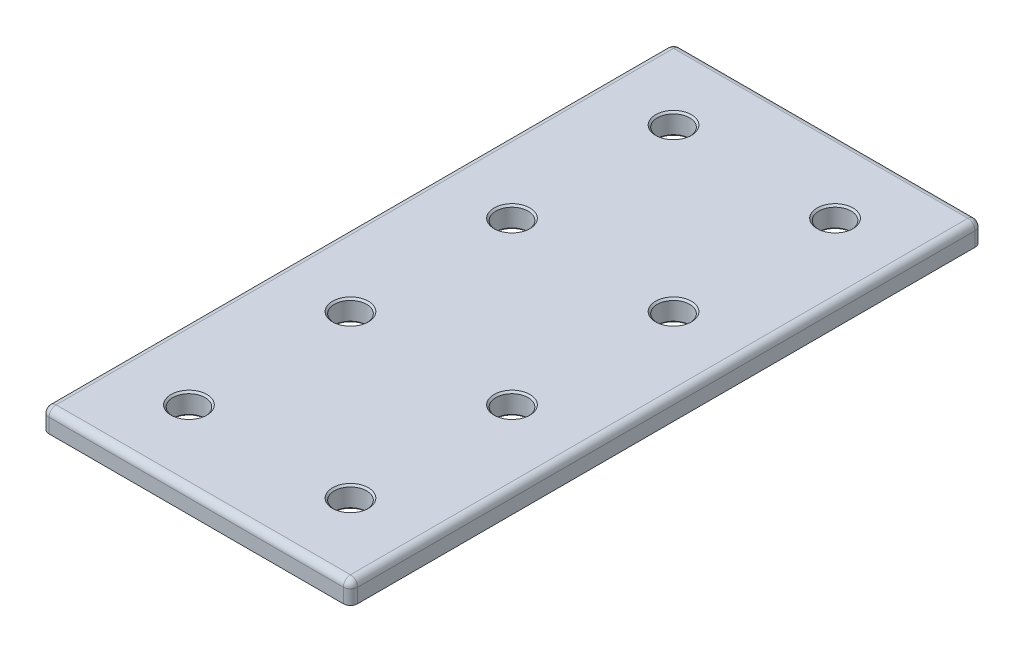
ISO-10303-21;
HEADER;
FILE_DESCRIPTION(('STEP AP214'),'2;1');
FILE_NAME('part.step','',(''),(''),'','','');
FILE_SCHEMA(('AUTOMOTIVE_DESIGN { 1 0 10303 214 1 1 1 1 }'));
ENDSEC;
DATA;
#1=APPLICATION_CONTEXT('core data for automotive mechanical design processes');
#2=APPLICATION_PROTOCOL_DEFINITION('international standard','automotive_design',2000,#1);
#3=PRODUCT_CONTEXT('',#1,'mechanical');
#4=PRODUCT('Part','Part','',(#3));
#5=PRODUCT_RELATED_PRODUCT_CATEGORY('part','',(#4));
#6=PRODUCT_DEFINITION_FORMATION('','',#4);
#7=PRODUCT_DEFINITION_CONTEXT('part definition',#1,'design');
#8=PRODUCT_DEFINITION('design','',#6,#7);
#9=PRODUCT_DEFINITION_SHAPE('','',#8);
#10=(LENGTH_UNIT() NAMED_UNIT(*) SI_UNIT(.MILLI.,.METRE.));
#11=(NAMED_UNIT(*) PLANE_ANGLE_UNIT() SI_UNIT($,.RADIAN.));
#12=(NAMED_UNIT(*) SI_UNIT($,.STERADIAN.) SOLID_ANGLE_UNIT());
#13=UNCERTAINTY_MEASURE_WITH_UNIT(LENGTH_MEASURE(1.E-05),#10,'distance_accuracy_value','');
#14=(GEOMETRIC_REPRESENTATION_CONTEXT(3) GLOBAL_UNCERTAINTY_ASSIGNED_CONTEXT((#13)) GLOBAL_UNIT_ASSIGNED_CONTEXT((#10,
#11,#12)) REPRESENTATION_CONTEXT('',''));
#15=CARTESIAN_POINT('',(0.,0.,0.));
#16=DIRECTION('',(0.,0.,1.));
#17=DIRECTION('',(1.,0.,0.));
#18=AXIS2_PLACEMENT_3D('',#15,#16,#17);
#19=CARTESIAN_POINT('',(22.5,5.5,67.5));
#20=DIRECTION('',(0.,1.,0.));
#21=DIRECTION('',(0.,0.,1.));
#22=AXIS2_PLACEMENT_3D('',#19,#20,#21);
#23=CONICAL_SURFACE('',#22,4.5,0.785398163397434);
#24=CARTESIAN_POINT('',(22.5,5.99999999999989,67.5));
#25=DIRECTION('',(0.,1.,0.));
#26=DIRECTION('',(0.,0.,1.));
#27=AXIS2_PLACEMENT_3D('',#24,#25,#26);
#28=CIRCLE('',#27,4.99999999999988);
#29=CARTESIAN_POINT('',(22.5,5.99999999999989,72.4999999999999));
#30=VERTEX_POINT('',#29);
#31=EDGE_CURVE('E19',#30,#30,#28,.F.);
#32=ORIENTED_EDGE('',*,*,#31,.F.);
#33=EDGE_LOOP('',(#32));
#34=FACE_BOUND('',#33,.T.);
#35=CARTESIAN_POINT('',(22.5,5.5,67.5));
#36=DIRECTION('',(0.,-1.,0.));
#37=DIRECTION('',(0.,0.,-1.));
#38=AXIS2_PLACEMENT_3D('',#35,#36,#37);
#39=CIRCLE('',#38,4.5);
#40=CARTESIAN_POINT('',(22.5,5.5,63.));
#41=VERTEX_POINT('',#40);
#42=EDGE_CURVE('E130',#41,#41,#39,.F.);
#43=ORIENTED_EDGE('',*,*,#42,.F.);
#44=EDGE_LOOP('',(#43));
#45=FACE_BOUND('',#44,.T.);
#46=ADVANCED_FACE('F15',(#34,#45),#23,.F.);
#47=CARTESIAN_POINT('',(-22.5,5.5,67.5));
#48=DIRECTION('',(0.,1.,0.));
#49=DIRECTION('',(0.,0.,1.));
#50=AXIS2_PLACEMENT_3D('',#47,#48,#49);
#51=CONICAL_SURFACE('',#50,4.5,0.785398163397434);
#52=CARTESIAN_POINT('',(-22.5,5.99999999999989,67.5));
#53=DIRECTION('',(0.,1.,0.));
#54=DIRECTION('',(0.,0.,1.));
#55=AXIS2_PLACEMENT_3D('',#52,#53,#54);
#56=CIRCLE('',#55,4.99999999999988);
#57=CARTESIAN_POINT('',(-22.5,5.99999999999989,72.4999999999999));
#58=VERTEX_POINT('',#57);
#59=EDGE_CURVE('E491',#58,#58,#56,.F.);
#60=ORIENTED_EDGE('',*,*,#59,.F.);
#61=EDGE_LOOP('',(#60));
#62=FACE_BOUND('',#61,.T.);
#63=CARTESIAN_POINT('',(-22.5,5.5,67.5));
#64=DIRECTION('',(0.,-1.,0.));
#65=DIRECTION('',(0.,0.,-1.));
#66=AXIS2_PLACEMENT_3D('',#63,#64,#65);
#67=CIRCLE('',#66,4.5);
#68=CARTESIAN_POINT('',(-22.5,5.5,63.));
#69=VERTEX_POINT('',#68);
#70=EDGE_CURVE('E502',#69,#69,#67,.F.);
#71=ORIENTED_EDGE('',*,*,#70,.F.);
#72=EDGE_LOOP('',(#71));
#73=FACE_BOUND('',#72,.T.);
#74=ADVANCED_FACE('F171',(#62,#73),#51,.F.);
#75=CARTESIAN_POINT('',(22.5,5.5,-67.5));
#76=DIRECTION('',(0.,1.,0.));
#77=DIRECTION('',(0.,0.,1.));
#78=AXIS2_PLACEMENT_3D('',#75,#76,#77);
#79=CONICAL_SURFACE('',#78,4.5,0.785398163397448);
#80=CARTESIAN_POINT('',(22.5,5.99999999999989,-67.5));
#81=DIRECTION('',(0.,1.,0.));
#82=DIRECTION('',(0.,0.,1.));
#83=AXIS2_PLACEMENT_3D('',#80,#81,#82);
#84=CIRCLE('',#83,4.9999999999999);
#85=CARTESIAN_POINT('',(22.5,5.99999999999989,-62.5000000000001));
#86=VERTEX_POINT('',#85);
#87=EDGE_CURVE('E489',#86,#86,#84,.F.);
#88=ORIENTED_EDGE('',*,*,#87,.F.);
#89=EDGE_LOOP('',(#88));
#90=FACE_BOUND('',#89,.T.);
#91=CARTESIAN_POINT('',(22.5,5.5,-67.5));
#92=DIRECTION('',(0.,-1.,0.));
#93=DIRECTION('',(0.,0.,-1.));
#94=AXIS2_PLACEMENT_3D('',#91,#92,#93);
#95=CIRCLE('',#94,4.5);
#96=CARTESIAN_POINT('',(22.5,5.5,-72.));
#97=VERTEX_POINT('',#96);
#98=EDGE_CURVE('E505',#97,#97,#95,.F.);
#99=ORIENTED_EDGE('',*,*,#98,.F.);
#100=EDGE_LOOP('',(#99));
#101=FACE_BOUND('',#100,.T.);
#102=ADVANCED_FACE('F167',(#90,#101),#79,.F.);
#103=CARTESIAN_POINT('',(-22.5,5.5,-67.5));
#104=DIRECTION('',(0.,1.,0.));
#105=DIRECTION('',(0.,0.,1.));
#106=AXIS2_PLACEMENT_3D('',#103,#104,#105);
#107=CONICAL_SURFACE('',#106,4.5,0.785398163397448);
#108=CARTESIAN_POINT('',(-22.5,5.99999999999989,-67.5));
#109=DIRECTION('',(0.,1.,0.));
#110=DIRECTION('',(0.,0.,1.));
#111=AXIS2_PLACEMENT_3D('',#108,#109,#110);
#112=CIRCLE('',#111,4.9999999999999);
#113=CARTESIAN_POINT('',(-22.5,5.99999999999989,-62.5000000000001));
#114=VERTEX_POINT('',#113);
#115=EDGE_CURVE('E486',#114,#114,#112,.F.);
#116=ORIENTED_EDGE('',*,*,#115,.F.);
#117=EDGE_LOOP('',(#116));
#118=FACE_BOUND('',#117,.T.);
#119=CARTESIAN_POINT('',(-22.5,5.5,-67.5));
#120=DIRECTION('',(0.,-1.,0.));
#121=DIRECTION('',(0.,0.,-1.));
#122=AXIS2_PLACEMENT_3D('',#119,#120,#121);
#123=CIRCLE('',#122,4.5);
#124=CARTESIAN_POINT('',(-22.5,5.5,-72.));
#125=VERTEX_POINT('',#124);
#126=EDGE_CURVE('E512',#125,#125,#123,.F.);
#127=ORIENTED_EDGE('',*,*,#126,.F.);
#128=EDGE_LOOP('',(#127));
#129=FACE_BOUND('',#128,.T.);
#130=ADVANCED_FACE('F163',(#118,#129),#107,.F.);
#131=CARTESIAN_POINT('',(22.5,5.5,22.5));
#132=DIRECTION('',(0.,1.,0.));
#133=DIRECTION('',(0.,0.,1.));
#134=AXIS2_PLACEMENT_3D('',#131,#132,#133);
#135=CONICAL_SURFACE('',#134,4.5,0.785398163397448);
#136=CARTESIAN_POINT('',(22.5,5.99999999999989,22.5));
#137=DIRECTION('',(0.,1.,0.));
#138=DIRECTION('',(0.,0.,1.));
#139=AXIS2_PLACEMENT_3D('',#136,#137,#138);
#140=CIRCLE('',#139,4.9999999999999);
#141=CARTESIAN_POINT('',(22.5,5.99999999999989,27.4999999999999));
#142=VERTEX_POINT('',#141);
#143=EDGE_CURVE('E483',#142,#142,#140,.F.);
#144=ORIENTED_EDGE('',*,*,#143,.F.);
#145=EDGE_LOOP('',(#144));
#146=FACE_BOUND('',#145,.T.);
#147=CARTESIAN_POINT('',(22.5,5.5,22.5));
#148=DIRECTION('',(0.,-1.,0.));
#149=DIRECTION('',(0.,0.,-1.));
#150=AXIS2_PLACEMENT_3D('',#147,#148,#149);
#151=CIRCLE('',#150,4.5);
#152=CARTESIAN_POINT('',(22.5,5.5,18.));
#153=VERTEX_POINT('',#152);
#154=EDGE_CURVE('E515',#153,#153,#151,.F.);
#155=ORIENTED_EDGE('',*,*,#154,.F.);
#156=EDGE_LOOP('',(#155));
#157=FACE_BOUND('',#156,.T.);
#158=ADVANCED_FACE('F159',(#146,#157),#135,.F.);
#159=CARTESIAN_POINT('',(22.5,5.5,-22.5));
#160=DIRECTION('',(0.,1.,0.));
#161=DIRECTION('',(0.,0.,1.));
#162=AXIS2_PLACEMENT_3D('',#159,#160,#161);
#163=CONICAL_SURFACE('',#162,4.5,0.785398163397448);
#164=CARTESIAN_POINT('',(22.5,5.99999999999989,-22.5));
#165=DIRECTION('',(0.,1.,0.));
#166=DIRECTION('',(0.,0.,1.));
#167=AXIS2_PLACEMENT_3D('',#164,#165,#166);
#168=CIRCLE('',#167,4.99999999999989);
#169=CARTESIAN_POINT('',(22.5,5.99999999999989,-17.5000000000001));
#170=VERTEX_POINT('',#169);
#171=EDGE_CURVE('E480',#170,#170,#168,.F.);
#172=ORIENTED_EDGE('',*,*,#171,.F.);
#173=EDGE_LOOP('',(#172));
#174=FACE_BOUND('',#173,.T.);
#175=CARTESIAN_POINT('',(22.5,5.5,-22.5));
#176=DIRECTION('',(0.,-1.,0.));
#177=DIRECTION('',(0.,0.,-1.));
#178=AXIS2_PLACEMENT_3D('',#175,#176,#177);
#179=CIRCLE('',#178,4.5);
#180=CARTESIAN_POINT('',(22.5,5.5,-27.));
#181=VERTEX_POINT('',#180);
#182=EDGE_CURVE('E518',#181,#181,#179,.F.);
#183=ORIENTED_EDGE('',*,*,#182,.F.);
#184=EDGE_LOOP('',(#183));
#185=FACE_BOUND('',#184,.T.);
#186=ADVANCED_FACE('F155',(#174,#185),#163,.F.);
#187=CARTESIAN_POINT('',(-22.5,5.5,-22.5));
#188=DIRECTION('',(0.,1.,0.));
#189=DIRECTION('',(0.,0.,1.));
#190=AXIS2_PLACEMENT_3D('',#187,#188,#189);
#191=CONICAL_SURFACE('',#190,4.5,0.785398163397448);
#192=CARTESIAN_POINT('',(-22.5,5.99999999999989,-22.5));
#193=DIRECTION('',(0.,1.,0.));
#194=DIRECTION('',(0.,0.,1.));
#195=AXIS2_PLACEMENT_3D('',#192,#193,#194);
#196=CIRCLE('',#195,4.99999999999989);
#197=CARTESIAN_POINT('',(-22.5,5.99999999999989,-17.5000000000001));
#198=VERTEX_POINT('',#197);
#199=EDGE_CURVE('E111',#198,#198,#196,.F.);
#200=ORIENTED_EDGE('',*,*,#199,.F.);
#201=EDGE_LOOP('',(#200));
#202=FACE_BOUND('',#201,.T.);
#203=CARTESIAN_POINT('',(-22.5,5.5,-22.5));
#204=DIRECTION('',(0.,-1.,0.));
#205=DIRECTION('',(0.,0.,-1.));
#206=AXIS2_PLACEMENT_3D('',#203,#204,#205);
#207=CIRCLE('',#206,4.5);
#208=CARTESIAN_POINT('',(-22.5,5.5,-27.));
#209=VERTEX_POINT('',#208);
#210=EDGE_CURVE('E477',#209,#209,#207,.F.);
#211=ORIENTED_EDGE('',*,*,#210,.F.);
#212=EDGE_LOOP('',(#211));
#213=FACE_BOUND('',#212,.T.);
#214=ADVANCED_FACE('F152',(#202,#213),#191,.F.);
#215=CARTESIAN_POINT('',(-41.,6.,-86.));
#216=DIRECTION('',(0.,1.,0.));
#217=DIRECTION('',(0.,0.,1.));
#218=AXIS2_PLACEMENT_3D('',#215,#216,#217);
#219=PLANE('',#218);
#220=CARTESIAN_POINT('',(-22.5,5.99999999999989,22.5));
#221=DIRECTION('',(0.,1.,0.));
#222=DIRECTION('',(0.,0.,1.));
#223=AXIS2_PLACEMENT_3D('',#220,#221,#222);
#224=CIRCLE('',#223,4.9999999999999);
#225=CARTESIAN_POINT('',(-22.5,5.99999999999989,27.4999999999999));
#226=VERTEX_POINT('',#225);
#227=EDGE_CURVE('E353',#226,#226,#224,.T.);
#228=ORIENTED_EDGE('',*,*,#227,.F.);
#229=EDGE_LOOP('',(#228));
#230=FACE_BOUND('',#229,.T.);
#231=ORIENTED_EDGE('',*,*,#199,.T.);
#232=EDGE_LOOP('',(#231));
#233=FACE_BOUND('',#232,.T.);
#234=ORIENTED_EDGE('',*,*,#171,.T.);
#235=EDGE_LOOP('',(#234));
#236=FACE_BOUND('',#235,.T.);
#237=ORIENTED_EDGE('',*,*,#143,.T.);
#238=EDGE_LOOP('',(#237));
#239=FACE_BOUND('',#238,.T.);
#240=ORIENTED_EDGE('',*,*,#115,.T.);
#241=EDGE_LOOP('',(#240));
#242=FACE_BOUND('',#241,.T.);
#243=ORIENTED_EDGE('',*,*,#87,.T.);
#244=EDGE_LOOP('',(#243));
#245=FACE_BOUND('',#244,.T.);
#246=ORIENTED_EDGE('',*,*,#59,.T.);
#247=EDGE_LOOP('',(#246));
#248=FACE_BOUND('',#247,.T.);
#249=ORIENTED_EDGE('',*,*,#31,.T.);
#250=EDGE_LOOP('',(#249));
#251=FACE_BOUND('',#250,.T.);
#252=DIRECTION('',(0.,0.,1.));
#253=VECTOR('',#252,1.);
#254=CARTESIAN_POINT('',(40.9999999995898,6.,0.));
#255=LINE('',#254,#253);
#256=CARTESIAN_POINT('',(40.9999999996923,5.99999999999999,85.999999995));
#257=VERTEX_POINT('',#256);
#258=CARTESIAN_POINT('',(40.9999999997949,5.99999999999999,-86.0000000046924));
#259=VERTEX_POINT('',#258);
#260=EDGE_CURVE('E118',#257,#259,#255,.F.);
#261=ORIENTED_EDGE('',*,*,#260,.T.);
#262=DIRECTION('',(1.,0.,0.));
#263=VECTOR('',#262,1.);
#264=CARTESIAN_POINT('',(0.,5.99999999999999,-85.9999999995898));
#265=LINE('',#264,#263);
#266=CARTESIAN_POINT('',(-40.9999999998462,5.99999999999999,-85.9999999997949));
#267=VERTEX_POINT('',#266);
#268=EDGE_CURVE('E114',#259,#267,#265,.F.);
#269=ORIENTED_EDGE('',*,*,#268,.T.);
#270=DIRECTION('',(0.,0.,-1.));
#271=VECTOR('',#270,1.);
#272=CARTESIAN_POINT('',(-40.9999999995898,6.,0.));
#273=LINE('',#272,#271);
#274=CARTESIAN_POINT('',(-41.,6.,85.9999999948975));
#275=VERTEX_POINT('',#274);
#276=EDGE_CURVE('E101',#267,#275,#273,.F.);
#277=ORIENTED_EDGE('',*,*,#276,.T.);
#278=DIRECTION('',(-1.,0.,0.));
#279=VECTOR('',#278,1.);
#280=CARTESIAN_POINT('',(0.,5.99999999999999,85.9999999995898));
#281=LINE('',#280,#279);
#282=EDGE_CURVE('E135',#275,#257,#281,.F.);
#283=ORIENTED_EDGE('',*,*,#282,.T.);
#284=EDGE_LOOP('',(#261,#269,#277,#283));
#285=FACE_BOUND('',#284,.T.);
#286=ADVANCED_FACE('F116',(#230,#233,#236,#239,#242,#245,#248,#251,#285),#219,.T.);
#287=CARTESIAN_POINT('',(-41.0000000000001,4.,-86.));
#288=DIRECTION('',(0.,0.,1.));
#289=DIRECTION('',(-1.,0.,0.));
#290=AXIS2_PLACEMENT_3D('',#287,#288,#289);
#291=SPHERICAL_SURFACE('',#290,2.);
#292=CARTESIAN_POINT('',(-41.,4.,-86.));
#293=DIRECTION('',(0.,-1.,0.));
#294=DIRECTION('',(0.,0.,-1.));
#295=AXIS2_PLACEMENT_3D('',#292,#293,#294);
#296=CIRCLE('',#295,1.99999999999999);
#297=CARTESIAN_POINT('',(-41.,4.,-88.));
#298=VERTEX_POINT('',#297);
#299=CARTESIAN_POINT('',(-43.,4.,-85.9999999998077));
#300=VERTEX_POINT('',#299);
#301=EDGE_CURVE('E66',#298,#300,#296,.F.);
#302=ORIENTED_EDGE('',*,*,#301,.T.);
#303=CARTESIAN_POINT('',(-41.,4.,-86.));
#304=DIRECTION('',(0.,0.,-1.));
#305=DIRECTION('',(-1.,0.,0.));
#306=AXIS2_PLACEMENT_3D('',#303,#304,#305);
#307=CIRCLE('',#306,2.);
#308=EDGE_CURVE('E106',#300,#267,#307,.T.);
#309=ORIENTED_EDGE('',*,*,#308,.T.);
#310=CARTESIAN_POINT('',(-41.,4.,-86.));
#311=DIRECTION('',(1.,0.,0.));
#312=DIRECTION('',(0.,0.,-1.));
#313=AXIS2_PLACEMENT_3D('',#310,#311,#312);
#314=CIRCLE('',#313,1.99999999999999);
#315=EDGE_CURVE('E122',#267,#298,#314,.F.);
#316=ORIENTED_EDGE('',*,*,#315,.T.);
#317=EDGE_LOOP('',(#302,#309,#316));
#318=FACE_BOUND('',#317,.T.);
#319=ADVANCED_FACE('F132',(#318),#291,.T.);
#320=CARTESIAN_POINT('',(-41.,4.,86.));
#321=DIRECTION('',(0.,0.,-1.));
#322=DIRECTION('',(0.,1.,0.));
#323=AXIS2_PLACEMENT_3D('',#320,#321,#322);
#324=CYLINDRICAL_SURFACE('',#323,2.);
#325=DIRECTION('',(0.,0.,1.));
#326=VECTOR('',#325,1.);
#327=CARTESIAN_POINT('',(-43.,4.,0.));
#328=LINE('',#327,#326);
#329=CARTESIAN_POINT('',(-43.,4.,85.9999999954873));
#330=VERTEX_POINT('',#329);
#331=EDGE_CURVE('E345',#300,#330,#328,.T.);
#332=ORIENTED_EDGE('',*,*,#331,.T.);
#333=CARTESIAN_POINT('',(-41.,4.,85.9999999804102));
#334=DIRECTION('',(0.,0.,1.));
#335=DIRECTION('',(1.,0.,0.));
#336=AXIS2_PLACEMENT_3D('',#333,#334,#335);
#337=CIRCLE('',#336,2.00000000000002);
#338=EDGE_CURVE('E107',#330,#275,#337,.F.);
#339=ORIENTED_EDGE('',*,*,#338,.T.);
#340=ORIENTED_EDGE('',*,*,#276,.F.);
#341=ORIENTED_EDGE('',*,*,#308,.F.);
#342=EDGE_LOOP('',(#332,#339,#340,#341));
#343=FACE_BOUND('',#342,.T.);
#344=ADVANCED_FACE('F104',(#343),#324,.T.);
#345=CARTESIAN_POINT('',(-41.,4.,86.));
#346=DIRECTION('',(0.,0.,1.));
#347=DIRECTION('',(-1.,0.,0.));
#348=AXIS2_PLACEMENT_3D('',#345,#346,#347);
#349=SPHERICAL_SURFACE('',#348,2.);
#350=CARTESIAN_POINT('',(-41.,4.,86.));
#351=DIRECTION('',(0.,-1.,0.));
#352=DIRECTION('',(0.,0.,-1.));
#353=AXIS2_PLACEMENT_3D('',#350,#351,#352);
#354=CIRCLE('',#353,2.);
#355=CARTESIAN_POINT('',(-41.0000000002051,4.,88.));
#356=VERTEX_POINT('',#355);
#357=EDGE_CURVE('E350',#330,#356,#354,.F.);
#358=ORIENTED_EDGE('',*,*,#357,.T.);
#359=CARTESIAN_POINT('',(-41.,4.,86.));
#360=DIRECTION('',(-1.,0.,0.));
#361=DIRECTION('',(0.,0.,1.));
#362=AXIS2_PLACEMENT_3D('',#359,#360,#361);
#363=CIRCLE('',#362,1.99999999999999);
#364=EDGE_CURVE('E428',#356,#275,#363,.T.);
#365=ORIENTED_EDGE('',*,*,#364,.T.);
#366=ORIENTED_EDGE('',*,*,#338,.F.);
#367=EDGE_LOOP('',(#358,#365,#366));
#368=FACE_BOUND('',#367,.T.);
#369=ADVANCED_FACE('F334',(#368),#349,.T.);
#370=CARTESIAN_POINT('',(41.,4.,86.));
#371=DIRECTION('',(-1.,0.,0.));
#372=DIRECTION('',(0.,0.,1.));
#373=AXIS2_PLACEMENT_3D('',#370,#371,#372);
#374=CYLINDRICAL_SURFACE('',#373,1.99999999999999);
#375=DIRECTION('',(1.,0.,0.));
#376=VECTOR('',#375,1.);
#377=CARTESIAN_POINT('',(0.,4.,88.));
#378=LINE('',#377,#376);
#379=CARTESIAN_POINT('',(40.9999999995898,4.,88.));
#380=VERTEX_POINT('',#379);
#381=EDGE_CURVE('E413',#356,#380,#378,.T.);
#382=ORIENTED_EDGE('',*,*,#381,.T.);
#383=CARTESIAN_POINT('',(41.,3.99999999999998,86.0000000000001));
#384=DIRECTION('',(1.,2.05103206470726E-10,0.));
#385=DIRECTION('',(0.,0.,-1.));
#386=AXIS2_PLACEMENT_3D('',#383,#384,#385);
#387=CIRCLE('',#386,2.);
#388=EDGE_CURVE('E316',#380,#257,#387,.F.);
#389=ORIENTED_EDGE('',*,*,#388,.T.);
#390=ORIENTED_EDGE('',*,*,#282,.F.);
#391=ORIENTED_EDGE('',*,*,#364,.F.);
#392=EDGE_LOOP('',(#382,#389,#390,#391));
#393=FACE_BOUND('',#392,.T.);
#394=ADVANCED_FACE('F331',(#393),#374,.T.);
#395=CARTESIAN_POINT('',(41.,4.,86.0000000000001));
#396=DIRECTION('',(0.,0.,1.));
#397=DIRECTION('',(-1.,0.,0.));
#398=AXIS2_PLACEMENT_3D('',#395,#396,#397);
#399=SPHERICAL_SURFACE('',#398,2.);
#400=CARTESIAN_POINT('',(41.,4.,86.));
#401=DIRECTION('',(0.,-1.,0.));
#402=DIRECTION('',(0.,0.,-1.));
#403=AXIS2_PLACEMENT_3D('',#400,#401,#402);
#404=CIRCLE('',#403,2.);
#405=CARTESIAN_POINT('',(43.,4.,86.0000000001026));
#406=VERTEX_POINT('',#405);
#407=EDGE_CURVE('E319',#380,#406,#404,.F.);
#408=ORIENTED_EDGE('',*,*,#407,.T.);
#409=CARTESIAN_POINT('',(41.,4.,86.));
#410=DIRECTION('',(0.,0.,1.));
#411=DIRECTION('',(1.,0.,0.));
#412=AXIS2_PLACEMENT_3D('',#409,#410,#411);
#413=CIRCLE('',#412,2.);
#414=EDGE_CURVE('E313',#406,#257,#413,.T.);
#415=ORIENTED_EDGE('',*,*,#414,.T.);
#416=ORIENTED_EDGE('',*,*,#388,.F.);
#417=EDGE_LOOP('',(#408,#415,#416));
#418=FACE_BOUND('',#417,.T.);
#419=ADVANCED_FACE('F328',(#418),#399,.T.);
#420=CARTESIAN_POINT('',(41.,4.,-86.));
#421=DIRECTION('',(0.,0.,1.));
#422=DIRECTION('',(0.,-1.,0.));
#423=AXIS2_PLACEMENT_3D('',#420,#421,#422);
#424=CYLINDRICAL_SURFACE('',#423,2.);
#425=ORIENTED_EDGE('',*,*,#260,.F.);
#426=ORIENTED_EDGE('',*,*,#414,.F.);
#427=DIRECTION('',(0.,0.,-1.));
#428=VECTOR('',#427,1.);
#429=CARTESIAN_POINT('',(43.,4.,0.));
#430=LINE('',#429,#428);
#431=CARTESIAN_POINT('',(43.,4.,-86.0000000046924));
#432=VERTEX_POINT('',#431);
#433=EDGE_CURVE('E306',#406,#432,#430,.T.);
#434=ORIENTED_EDGE('',*,*,#433,.T.);
#435=CARTESIAN_POINT('',(41.,4.,-86.0000000195898));
#436=DIRECTION('',(0.,0.,1.));
#437=DIRECTION('',(1.,0.,0.));
#438=AXIS2_PLACEMENT_3D('',#435,#436,#437);
#439=CIRCLE('',#438,1.99999999999998);
#440=EDGE_CURVE('E302',#432,#259,#439,.T.);
#441=ORIENTED_EDGE('',*,*,#440,.T.);
#442=EDGE_LOOP('',(#425,#426,#434,#441));
#443=FACE_BOUND('',#442,.T.);
#444=ADVANCED_FACE('F294',(#443),#424,.T.);
#445=CARTESIAN_POINT('',(41.,4.,-86.0000000000001));
#446=DIRECTION('',(0.,0.,1.));
#447=DIRECTION('',(-1.,0.,0.));
#448=AXIS2_PLACEMENT_3D('',#445,#446,#447);
#449=SPHERICAL_SURFACE('',#448,2.);
#450=CARTESIAN_POINT('',(41.,4.,-86.));
#451=DIRECTION('',(1.,0.,0.));
#452=DIRECTION('',(0.,0.,-1.));
#453=AXIS2_PLACEMENT_3D('',#450,#451,#452);
#454=CIRCLE('',#453,1.99999999999999);
#455=CARTESIAN_POINT('',(41.,4.,-88.));
#456=VERTEX_POINT('',#455);
#457=EDGE_CURVE('E123',#456,#259,#454,.T.);
#458=ORIENTED_EDGE('',*,*,#457,.T.);
#459=ORIENTED_EDGE('',*,*,#440,.F.);
#460=CARTESIAN_POINT('',(41.,4.,-86.));
#461=DIRECTION('',(0.,-1.,0.));
#462=DIRECTION('',(0.,0.,-1.));
#463=AXIS2_PLACEMENT_3D('',#460,#461,#462);
#464=CIRCLE('',#463,1.99999999999999);
#465=EDGE_CURVE('E393',#432,#456,#464,.F.);
#466=ORIENTED_EDGE('',*,*,#465,.T.);
#467=EDGE_LOOP('',(#458,#459,#466));
#468=FACE_BOUND('',#467,.T.);
#469=ADVANCED_FACE('F290',(#468),#449,.T.);
#470=CARTESIAN_POINT('',(-41.,4.,-86.));
#471=DIRECTION('',(1.,0.,0.));
#472=DIRECTION('',(0.,0.,-1.));
#473=AXIS2_PLACEMENT_3D('',#470,#471,#472);
#474=CYLINDRICAL_SURFACE('',#473,1.99999999999999);
#475=ORIENTED_EDGE('',*,*,#268,.F.);
#476=ORIENTED_EDGE('',*,*,#457,.F.);
#477=DIRECTION('',(-1.,0.,0.));
#478=VECTOR('',#477,1.);
#479=CARTESIAN_POINT('',(0.,4.,-88.));
#480=LINE('',#479,#478);
#481=EDGE_CURVE('E127',#456,#298,#480,.T.);
#482=ORIENTED_EDGE('',*,*,#481,.T.);
#483=ORIENTED_EDGE('',*,*,#315,.F.);
#484=EDGE_LOOP('',(#475,#476,#482,#483));
#485=FACE_BOUND('',#484,.T.);
#486=ADVANCED_FACE('F126',(#485),#474,.T.);
#487=CARTESIAN_POINT('',(22.5,5.5,67.5));
#488=DIRECTION('',(0.,-1.,0.));
#489=DIRECTION('',(0.,0.,-1.));
#490=AXIS2_PLACEMENT_3D('',#487,#488,#489);
#491=CYLINDRICAL_SURFACE('',#490,4.5);
#492=CARTESIAN_POINT('',(22.5,0.499999999999945,67.5));
#493=DIRECTION('',(0.,-1.,0.));
#494=DIRECTION('',(0.,0.,-1.));
#495=AXIS2_PLACEMENT_3D('',#492,#493,#494);
#496=CIRCLE('',#495,4.5);
#497=CARTESIAN_POINT('',(22.5,0.5,63.));
#498=VERTEX_POINT('',#497);
#499=EDGE_CURVE('E380',#498,#498,#496,.F.);
#500=ORIENTED_EDGE('',*,*,#499,.F.);
#501=EDGE_LOOP('',(#500));
#502=FACE_BOUND('',#501,.T.);
#503=ORIENTED_EDGE('',*,*,#42,.T.);
#504=EDGE_LOOP('',(#503));
#505=FACE_BOUND('',#504,.T.);
#506=ADVANCED_FACE('F283',(#502,#505),#491,.F.);
#507=CARTESIAN_POINT('',(-22.5,5.5,67.5));
#508=DIRECTION('',(0.,-1.,0.));
#509=DIRECTION('',(0.,0.,-1.));
#510=AXIS2_PLACEMENT_3D('',#507,#508,#509);
#511=CYLINDRICAL_SURFACE('',#510,4.5);
#512=CARTESIAN_POINT('',(-22.5,0.499999999999945,67.5));
#513=DIRECTION('',(0.,-1.,0.));
#514=DIRECTION('',(0.,0.,-1.));
#515=AXIS2_PLACEMENT_3D('',#512,#513,#514);
#516=CIRCLE('',#515,4.5);
#517=CARTESIAN_POINT('',(-22.5,0.5,63.));
#518=VERTEX_POINT('',#517);
#519=EDGE_CURVE('E377',#518,#518,#516,.F.);
#520=ORIENTED_EDGE('',*,*,#519,.F.);
#521=EDGE_LOOP('',(#520));
#522=FACE_BOUND('',#521,.T.);
#523=ORIENTED_EDGE('',*,*,#70,.T.);
#524=EDGE_LOOP('',(#523));
#525=FACE_BOUND('',#524,.T.);
#526=ADVANCED_FACE('F279',(#522,#525),#511,.F.);
#527=CARTESIAN_POINT('',(22.5,5.5,-67.5));
#528=DIRECTION('',(0.,-1.,0.));
#529=DIRECTION('',(0.,0.,-1.));
#530=AXIS2_PLACEMENT_3D('',#527,#528,#529);
#531=CYLINDRICAL_SURFACE('',#530,4.5);
#532=CARTESIAN_POINT('',(22.5,0.499999999999945,-67.5));
#533=DIRECTION('',(0.,-1.,0.));
#534=DIRECTION('',(0.,0.,-1.));
#535=AXIS2_PLACEMENT_3D('',#532,#533,#534);
#536=CIRCLE('',#535,4.5);
#537=CARTESIAN_POINT('',(22.5,0.5,-72.));
#538=VERTEX_POINT('',#537);
#539=EDGE_CURVE('E374',#538,#538,#536,.F.);
#540=ORIENTED_EDGE('',*,*,#539,.F.);
#541=EDGE_LOOP('',(#540));
#542=FACE_BOUND('',#541,.T.);
#543=ORIENTED_EDGE('',*,*,#98,.T.);
#544=EDGE_LOOP('',(#543));
#545=FACE_BOUND('',#544,.T.);
#546=ADVANCED_FACE('F275',(#542,#545),#531,.F.);
#547=CARTESIAN_POINT('',(-22.5,5.5,-67.5));
#548=DIRECTION('',(0.,-1.,0.));
#549=DIRECTION('',(0.,0.,-1.));
#550=AXIS2_PLACEMENT_3D('',#547,#548,#549);
#551=CYLINDRICAL_SURFACE('',#550,4.5);
#552=CARTESIAN_POINT('',(-22.5,0.499999999999945,-67.5));
#553=DIRECTION('',(0.,-1.,0.));
#554=DIRECTION('',(0.,0.,-1.));
#555=AXIS2_PLACEMENT_3D('',#552,#553,#554);
#556=CIRCLE('',#555,4.5);
#557=CARTESIAN_POINT('',(-22.5,0.5,-72.));
#558=VERTEX_POINT('',#557);
#559=EDGE_CURVE('E371',#558,#558,#556,.F.);
#560=ORIENTED_EDGE('',*,*,#559,.F.);
#561=EDGE_LOOP('',(#560));
#562=FACE_BOUND('',#561,.T.);
#563=ORIENTED_EDGE('',*,*,#126,.T.);
#564=EDGE_LOOP('',(#563));
#565=FACE_BOUND('',#564,.T.);
#566=ADVANCED_FACE('F271',(#562,#565),#551,.F.);
#567=CARTESIAN_POINT('',(22.5,5.5,22.5));
#568=DIRECTION('',(0.,-1.,0.));
#569=DIRECTION('',(0.,0.,-1.));
#570=AXIS2_PLACEMENT_3D('',#567,#568,#569);
#571=CYLINDRICAL_SURFACE('',#570,4.5);
#572=CARTESIAN_POINT('',(22.5,0.499999999999945,22.5));
#573=DIRECTION('',(0.,-1.,0.));
#574=DIRECTION('',(0.,0.,-1.));
#575=AXIS2_PLACEMENT_3D('',#572,#573,#574);
#576=CIRCLE('',#575,4.5);
#577=CARTESIAN_POINT('',(22.5,0.5,18.));
#578=VERTEX_POINT('',#577);
#579=EDGE_CURVE('E368',#578,#578,#576,.F.);
#580=ORIENTED_EDGE('',*,*,#579,.F.);
#581=EDGE_LOOP('',(#580));
#582=FACE_BOUND('',#581,.T.);
#583=ORIENTED_EDGE('',*,*,#154,.T.);
#584=EDGE_LOOP('',(#583));
#585=FACE_BOUND('',#584,.T.);
#586=ADVANCED_FACE('F267',(#582,#585),#571,.F.);
#587=CARTESIAN_POINT('',(22.5,5.5,-22.5));
#588=DIRECTION('',(0.,-1.,0.));
#589=DIRECTION('',(0.,0.,-1.));
#590=AXIS2_PLACEMENT_3D('',#587,#588,#589);
#591=CYLINDRICAL_SURFACE('',#590,4.5);
#592=CARTESIAN_POINT('',(22.5,0.499999999999945,-22.5));
#593=DIRECTION('',(0.,-1.,0.));
#594=DIRECTION('',(0.,0.,-1.));
#595=AXIS2_PLACEMENT_3D('',#592,#593,#594);
#596=CIRCLE('',#595,4.5);
#597=CARTESIAN_POINT('',(22.5,0.5,-27.));
#598=VERTEX_POINT('',#597);
#599=EDGE_CURVE('E365',#598,#598,#596,.F.);
#600=ORIENTED_EDGE('',*,*,#599,.F.);
#601=EDGE_LOOP('',(#600));
#602=FACE_BOUND('',#601,.T.);
#603=ORIENTED_EDGE('',*,*,#182,.T.);
#604=EDGE_LOOP('',(#603));
#605=FACE_BOUND('',#604,.T.);
#606=ADVANCED_FACE('F263',(#602,#605),#591,.F.);
#607=CARTESIAN_POINT('',(-22.5,5.5,-22.5));
#608=DIRECTION('',(0.,-1.,0.));
#609=DIRECTION('',(0.,0.,-1.));
#610=AXIS2_PLACEMENT_3D('',#607,#608,#609);
#611=CYLINDRICAL_SURFACE('',#610,4.5);
#612=CARTESIAN_POINT('',(-22.5,0.499999999999945,-22.5));
#613=DIRECTION('',(0.,-1.,0.));
#614=DIRECTION('',(0.,0.,-1.));
#615=AXIS2_PLACEMENT_3D('',#612,#613,#614);
#616=CIRCLE('',#615,4.5);
#617=CARTESIAN_POINT('',(-22.5,0.5,-27.));
#618=VERTEX_POINT('',#617);
#619=EDGE_CURVE('E362',#618,#618,#616,.F.);
#620=ORIENTED_EDGE('',*,*,#619,.F.);
#621=EDGE_LOOP('',(#620));
#622=FACE_BOUND('',#621,.T.);
#623=ORIENTED_EDGE('',*,*,#210,.T.);
#624=EDGE_LOOP('',(#623));
#625=FACE_BOUND('',#624,.T.);
#626=ADVANCED_FACE('F259',(#622,#625),#611,.F.);
#627=CARTESIAN_POINT('',(-22.5,5.5,22.5));
#628=DIRECTION('',(0.,1.,0.));
#629=DIRECTION('',(0.,0.,1.));
#630=AXIS2_PLACEMENT_3D('',#627,#628,#629);
#631=CONICAL_SURFACE('',#630,4.5,0.785398163397448);
#632=ORIENTED_EDGE('',*,*,#227,.T.);
#633=EDGE_LOOP('',(#632));
#634=FACE_BOUND('',#633,.T.);
#635=CARTESIAN_POINT('',(-22.5,5.5,22.5));
#636=DIRECTION('',(0.,-1.,0.));
#637=DIRECTION('',(0.,0.,-1.));
#638=AXIS2_PLACEMENT_3D('',#635,#636,#637);
#639=CIRCLE('',#638,4.5);
#640=CARTESIAN_POINT('',(-22.5,5.5,18.));
#641=VERTEX_POINT('',#640);
#642=EDGE_CURVE('E145',#641,#641,#639,.F.);
#643=ORIENTED_EDGE('',*,*,#642,.F.);
#644=EDGE_LOOP('',(#643));
#645=FACE_BOUND('',#644,.T.);
#646=ADVANCED_FACE('F256',(#634,#645),#631,.F.);
#647=CARTESIAN_POINT('',(-41.,4.,-86.));
#648=DIRECTION('',(0.,-1.,0.));
#649=DIRECTION('',(0.,0.,-1.));
#650=AXIS2_PLACEMENT_3D('',#647,#648,#649);
#651=CYLINDRICAL_SURFACE('',#650,1.99999999999999);
#652=ORIENTED_EDGE('',*,*,#301,.F.);
#653=DIRECTION('',(0.,-1.,0.));
#654=VECTOR('',#653,1.);
#655=CARTESIAN_POINT('',(-41.,2.,-88.));
#656=LINE('',#655,#654);
#657=CARTESIAN_POINT('',(-41.,0.,-88.));
#658=VERTEX_POINT('',#657);
#659=EDGE_CURVE('E382',#298,#658,#656,.T.);
#660=ORIENTED_EDGE('',*,*,#659,.T.);
#661=CARTESIAN_POINT('',(-41.,0.,-86.));
#662=DIRECTION('',(0.,-1.,0.));
#663=DIRECTION('',(0.,0.,-1.));
#664=AXIS2_PLACEMENT_3D('',#661,#662,#663);
#665=CIRCLE('',#664,1.99999999999999);
#666=CARTESIAN_POINT('',(-43.,0.,-86.));
#667=VERTEX_POINT('',#666);
#668=EDGE_CURVE('E57',#658,#667,#665,.F.);
#669=ORIENTED_EDGE('',*,*,#668,.T.);
#670=DIRECTION('',(0.,1.,0.));
#671=VECTOR('',#670,1.);
#672=CARTESIAN_POINT('',(-43.,2.,-86.));
#673=LINE('',#672,#671);
#674=EDGE_CURVE('E347',#667,#300,#673,.T.);
#675=ORIENTED_EDGE('',*,*,#674,.T.);
#676=EDGE_LOOP('',(#652,#660,#669,#675));
#677=FACE_BOUND('',#676,.T.);
#678=ADVANCED_FACE('F186',(#677),#651,.T.);
#679=CARTESIAN_POINT('',(-43.,0.,86.));
#680=DIRECTION('',(1.,0.,0.));
#681=DIRECTION('',(0.,0.,-1.));
#682=AXIS2_PLACEMENT_3D('',#679,#680,#681);
#683=PLANE('',#682);
#684=ORIENTED_EDGE('',*,*,#331,.F.);
#685=ORIENTED_EDGE('',*,*,#674,.F.);
#686=DIRECTION('',(0.,0.,1.));
#687=VECTOR('',#686,1.);
#688=CARTESIAN_POINT('',(-43.,0.,0.));
#689=LINE('',#688,#687);
#690=CARTESIAN_POINT('',(-43.,0.,86.0000000003847));
#691=VERTEX_POINT('',#690);
#692=EDGE_CURVE('E473',#667,#691,#689,.T.);
#693=ORIENTED_EDGE('',*,*,#692,.T.);
#694=DIRECTION('',(0.,-1.,0.));
#695=VECTOR('',#694,1.);
#696=CARTESIAN_POINT('',(-43.,2.,86.0000000007694));
#697=LINE('',#696,#695);
#698=EDGE_CURVE('E346',#691,#330,#697,.F.);
#699=ORIENTED_EDGE('',*,*,#698,.T.);
#700=EDGE_LOOP('',(#684,#685,#693,#699));
#701=FACE_BOUND('',#700,.T.);
#702=ADVANCED_FACE('F182',(#701),#683,.F.);
#703=CARTESIAN_POINT('',(-41.,4.,86.));
#704=DIRECTION('',(0.,-1.,0.));
#705=DIRECTION('',(0.,0.,-1.));
#706=AXIS2_PLACEMENT_3D('',#703,#704,#705);
#707=CYLINDRICAL_SURFACE('',#706,2.);
#708=ORIENTED_EDGE('',*,*,#357,.F.);
#709=ORIENTED_EDGE('',*,*,#698,.F.);
#710=CARTESIAN_POINT('',(-41.,0.,86.));
#711=DIRECTION('',(0.,-1.,0.));
#712=DIRECTION('',(0.,0.,-1.));
#713=AXIS2_PLACEMENT_3D('',#710,#711,#712);
#714=CIRCLE('',#713,2.);
#715=CARTESIAN_POINT('',(-41.,0.,88.));
#716=VERTEX_POINT('',#715);
#717=EDGE_CURVE('E471',#691,#716,#714,.F.);
#718=ORIENTED_EDGE('',*,*,#717,.T.);
#719=DIRECTION('',(0.,1.,0.));
#720=VECTOR('',#719,1.);
#721=CARTESIAN_POINT('',(-41.,2.,88.));
#722=LINE('',#721,#720);
#723=EDGE_CURVE('E416',#716,#356,#722,.T.);
#724=ORIENTED_EDGE('',*,*,#723,.T.);
#725=EDGE_LOOP('',(#708,#709,#718,#724));
#726=FACE_BOUND('',#725,.T.);
#727=ADVANCED_FACE('F185',(#726),#707,.T.);
#728=CARTESIAN_POINT('',(41.,0.,88.));
#729=DIRECTION('',(0.,0.,-1.));
#730=DIRECTION('',(-1.,0.,0.));
#731=AXIS2_PLACEMENT_3D('',#728,#729,#730);
#732=PLANE('',#731);
#733=ORIENTED_EDGE('',*,*,#381,.F.);
#734=ORIENTED_EDGE('',*,*,#723,.F.);
#735=DIRECTION('',(1.,0.,0.));
#736=VECTOR('',#735,1.);
#737=CARTESIAN_POINT('',(0.,0.,88.));
#738=LINE('',#737,#736);
#739=CARTESIAN_POINT('',(40.9999999995898,0.,88.));
#740=VERTEX_POINT('',#739);
#741=EDGE_CURVE('E470',#716,#740,#738,.T.);
#742=ORIENTED_EDGE('',*,*,#741,.T.);
#743=DIRECTION('',(0.,-1.,0.));
#744=VECTOR('',#743,1.);
#745=CARTESIAN_POINT('',(40.9999999991796,2.,88.));
#746=LINE('',#745,#744);
#747=EDGE_CURVE('E322',#740,#380,#746,.F.);
#748=ORIENTED_EDGE('',*,*,#747,.T.);
#749=EDGE_LOOP('',(#733,#734,#742,#748));
#750=FACE_BOUND('',#749,.T.);
#751=ADVANCED_FACE('F188',(#750),#732,.F.);
#752=CARTESIAN_POINT('',(41.,4.,86.));
#753=DIRECTION('',(0.,-1.,0.));
#754=DIRECTION('',(0.,0.,-1.));
#755=AXIS2_PLACEMENT_3D('',#752,#753,#754);
#756=CYLINDRICAL_SURFACE('',#755,2.);
#757=ORIENTED_EDGE('',*,*,#407,.F.);
#758=ORIENTED_EDGE('',*,*,#747,.F.);
#759=CARTESIAN_POINT('',(41.,0.,86.));
#760=DIRECTION('',(0.,-1.,0.));
#761=DIRECTION('',(0.,0.,-1.));
#762=AXIS2_PLACEMENT_3D('',#759,#760,#761);
#763=CIRCLE('',#762,2.);
#764=CARTESIAN_POINT('',(43.,0.,86.));
#765=VERTEX_POINT('',#764);
#766=EDGE_CURVE('E467',#740,#765,#763,.F.);
#767=ORIENTED_EDGE('',*,*,#766,.T.);
#768=DIRECTION('',(0.,1.,0.));
#769=VECTOR('',#768,1.);
#770=CARTESIAN_POINT('',(43.,2.,86.));
#771=LINE('',#770,#769);
#772=EDGE_CURVE('E310',#765,#406,#771,.T.);
#773=ORIENTED_EDGE('',*,*,#772,.T.);
#774=EDGE_LOOP('',(#757,#758,#767,#773));
#775=FACE_BOUND('',#774,.T.);
#776=ADVANCED_FACE('F191',(#775),#756,.T.);
#777=CARTESIAN_POINT('',(43.,0.,-86.));
#778=DIRECTION('',(-1.,0.,0.));
#779=DIRECTION('',(0.,0.,1.));
#780=AXIS2_PLACEMENT_3D('',#777,#778,#779);
#781=PLANE('',#780);
#782=ORIENTED_EDGE('',*,*,#433,.F.);
#783=ORIENTED_EDGE('',*,*,#772,.F.);
#784=DIRECTION('',(0.,0.,-1.));
#785=VECTOR('',#784,1.);
#786=CARTESIAN_POINT('',(43.,0.,0.));
#787=LINE('',#786,#785);
#788=CARTESIAN_POINT('',(43.,0.,-85.9999999997949));
#789=VERTEX_POINT('',#788);
#790=EDGE_CURVE('E466',#765,#789,#787,.T.);
#791=ORIENTED_EDGE('',*,*,#790,.T.);
#792=DIRECTION('',(0.,-1.,0.));
#793=VECTOR('',#792,1.);
#794=CARTESIAN_POINT('',(43.,2.,-85.9999999995898));
#795=LINE('',#794,#793);
#796=EDGE_CURVE('E309',#789,#432,#795,.F.);
#797=ORIENTED_EDGE('',*,*,#796,.T.);
#798=EDGE_LOOP('',(#782,#783,#791,#797));
#799=FACE_BOUND('',#798,.T.);
#800=ADVANCED_FACE('F193',(#799),#781,.F.);
#801=CARTESIAN_POINT('',(41.,4.,-86.));
#802=DIRECTION('',(0.,-1.,0.));
#803=DIRECTION('',(0.,0.,-1.));
#804=AXIS2_PLACEMENT_3D('',#801,#802,#803);
#805=CYLINDRICAL_SURFACE('',#804,1.99999999999999);
#806=ORIENTED_EDGE('',*,*,#465,.F.);
#807=ORIENTED_EDGE('',*,*,#796,.F.);
#808=CARTESIAN_POINT('',(41.,0.,-86.));
#809=DIRECTION('',(0.,-1.,0.));
#810=DIRECTION('',(0.,0.,-1.));
#811=AXIS2_PLACEMENT_3D('',#808,#809,#810);
#812=CIRCLE('',#811,1.99999999999999);
#813=CARTESIAN_POINT('',(41.,0.,-88.));
#814=VERTEX_POINT('',#813);
#815=EDGE_CURVE('E463',#789,#814,#812,.F.);
#816=ORIENTED_EDGE('',*,*,#815,.T.);
#817=DIRECTION('',(0.,1.,0.));
#818=VECTOR('',#817,1.);
#819=CARTESIAN_POINT('',(41.,2.,-88.));
#820=LINE('',#819,#818);
#821=EDGE_CURVE('E34',#814,#456,#820,.T.);
#822=ORIENTED_EDGE('',*,*,#821,.T.);
#823=EDGE_LOOP('',(#806,#807,#816,#822));
#824=FACE_BOUND('',#823,.T.);
#825=ADVANCED_FACE('F195',(#824),#805,.T.);
#826=CARTESIAN_POINT('',(-41.,0.,-88.));
#827=DIRECTION('',(0.,0.,1.));
#828=DIRECTION('',(1.,0.,0.));
#829=AXIS2_PLACEMENT_3D('',#826,#827,#828);
#830=PLANE('',#829);
#831=ORIENTED_EDGE('',*,*,#481,.F.);
#832=ORIENTED_EDGE('',*,*,#821,.F.);
#833=DIRECTION('',(-1.,0.,0.));
#834=VECTOR('',#833,1.);
#835=CARTESIAN_POINT('',(0.,0.,-88.));
#836=LINE('',#835,#834);
#837=EDGE_CURVE('E462',#814,#658,#836,.T.);
#838=ORIENTED_EDGE('',*,*,#837,.T.);
#839=ORIENTED_EDGE('',*,*,#659,.F.);
#840=EDGE_LOOP('',(#831,#832,#838,#839));
#841=FACE_BOUND('',#840,.T.);
#842=ADVANCED_FACE('F197',(#841),#830,.F.);
#843=CARTESIAN_POINT('',(22.5,0.5,67.5));
#844=DIRECTION('',(0.,-1.,0.));
#845=DIRECTION('',(0.,0.,-1.));
#846=AXIS2_PLACEMENT_3D('',#843,#844,#845);
#847=CONICAL_SURFACE('',#846,4.5,0.785398163397449);
#848=CARTESIAN_POINT('',(22.5,0.,67.5));
#849=DIRECTION('',(0.,-1.,0.));
#850=DIRECTION('',(0.,0.,-1.));
#851=AXIS2_PLACEMENT_3D('',#848,#849,#850);
#852=CIRCLE('',#851,4.99999999999999);
#853=CARTESIAN_POINT('',(22.5,0.,62.5));
#854=VERTEX_POINT('',#853);
#855=EDGE_CURVE('E459',#854,#854,#852,.T.);
#856=ORIENTED_EDGE('',*,*,#855,.T.);
#857=EDGE_LOOP('',(#856));
#858=FACE_BOUND('',#857,.T.);
#859=ORIENTED_EDGE('',*,*,#499,.T.);
#860=EDGE_LOOP('',(#859));
#861=FACE_BOUND('',#860,.T.);
#862=ADVANCED_FACE('F199',(#858,#861),#847,.F.);
#863=CARTESIAN_POINT('',(-22.5,0.5,67.5));
#864=DIRECTION('',(0.,-1.,0.));
#865=DIRECTION('',(0.,0.,-1.));
#866=AXIS2_PLACEMENT_3D('',#863,#864,#865);
#867=CONICAL_SURFACE('',#866,4.5,0.785398163397449);
#868=CARTESIAN_POINT('',(-22.5,0.,67.5));
#869=DIRECTION('',(0.,-1.,0.));
#870=DIRECTION('',(0.,0.,-1.));
#871=AXIS2_PLACEMENT_3D('',#868,#869,#870);
#872=CIRCLE('',#871,5.);
#873=CARTESIAN_POINT('',(-22.5,0.,62.5));
#874=VERTEX_POINT('',#873);
#875=EDGE_CURVE('E456',#874,#874,#872,.T.);
#876=ORIENTED_EDGE('',*,*,#875,.T.);
#877=EDGE_LOOP('',(#876));
#878=FACE_BOUND('',#877,.T.);
#879=ORIENTED_EDGE('',*,*,#519,.T.);
#880=EDGE_LOOP('',(#879));
#881=FACE_BOUND('',#880,.T.);
#882=ADVANCED_FACE('F205',(#878,#881),#867,.F.);
#883=CARTESIAN_POINT('',(22.5,0.5,-67.5));
#884=DIRECTION('',(0.,-1.,0.));
#885=DIRECTION('',(0.,0.,-1.));
#886=AXIS2_PLACEMENT_3D('',#883,#884,#885);
#887=CONICAL_SURFACE('',#886,4.5,0.785398163397435);
#888=CARTESIAN_POINT('',(22.5,0.,-67.5));
#889=DIRECTION('',(0.,-1.,0.));
#890=DIRECTION('',(0.,0.,-1.));
#891=AXIS2_PLACEMENT_3D('',#888,#889,#890);
#892=CIRCLE('',#891,4.99999999999999);
#893=CARTESIAN_POINT('',(22.5,0.,-72.5));
#894=VERTEX_POINT('',#893);
#895=EDGE_CURVE('E453',#894,#894,#892,.T.);
#896=ORIENTED_EDGE('',*,*,#895,.T.);
#897=EDGE_LOOP('',(#896));
#898=FACE_BOUND('',#897,.T.);
#899=ORIENTED_EDGE('',*,*,#539,.T.);
#900=EDGE_LOOP('',(#899));
#901=FACE_BOUND('',#900,.T.);
#902=ADVANCED_FACE('F240',(#898,#901),#887,.F.);
#903=CARTESIAN_POINT('',(-22.5,0.5,-67.5));
#904=DIRECTION('',(0.,-1.,0.));
#905=DIRECTION('',(0.,0.,-1.));
#906=AXIS2_PLACEMENT_3D('',#903,#904,#905);
#907=CONICAL_SURFACE('',#906,4.5,0.785398163397435);
#908=CARTESIAN_POINT('',(-22.5,0.,-67.5));
#909=DIRECTION('',(0.,-1.,0.));
#910=DIRECTION('',(0.,0.,-1.));
#911=AXIS2_PLACEMENT_3D('',#908,#909,#910);
#912=CIRCLE('',#911,4.99999999999999);
#913=CARTESIAN_POINT('',(-22.5,0.,-72.5));
#914=VERTEX_POINT('',#913);
#915=EDGE_CURVE('E450',#914,#914,#912,.T.);
#916=ORIENTED_EDGE('',*,*,#915,.T.);
#917=EDGE_LOOP('',(#916));
#918=FACE_BOUND('',#917,.T.);
#919=ORIENTED_EDGE('',*,*,#559,.T.);
#920=EDGE_LOOP('',(#919));
#921=FACE_BOUND('',#920,.T.);
#922=ADVANCED_FACE('F236',(#918,#921),#907,.F.);
#923=CARTESIAN_POINT('',(22.5,0.5,22.5));
#924=DIRECTION('',(0.,-1.,0.));
#925=DIRECTION('',(0.,0.,-1.));
#926=AXIS2_PLACEMENT_3D('',#923,#924,#925);
#927=CONICAL_SURFACE('',#926,4.5,0.785398163397449);
#928=CARTESIAN_POINT('',(22.5,0.,22.5));
#929=DIRECTION('',(0.,-1.,0.));
#930=DIRECTION('',(0.,0.,-1.));
#931=AXIS2_PLACEMENT_3D('',#928,#929,#930);
#932=CIRCLE('',#931,4.99999999999999);
#933=CARTESIAN_POINT('',(22.5,0.,17.5));
#934=VERTEX_POINT('',#933);
#935=EDGE_CURVE('E447',#934,#934,#932,.T.);
#936=ORIENTED_EDGE('',*,*,#935,.T.);
#937=EDGE_LOOP('',(#936));
#938=FACE_BOUND('',#937,.T.);
#939=ORIENTED_EDGE('',*,*,#579,.T.);
#940=EDGE_LOOP('',(#939));
#941=FACE_BOUND('',#940,.T.);
#942=ADVANCED_FACE('F232',(#938,#941),#927,.F.);
#943=CARTESIAN_POINT('',(22.5,0.5,-22.5));
#944=DIRECTION('',(0.,-1.,0.));
#945=DIRECTION('',(0.,0.,-1.));
#946=AXIS2_PLACEMENT_3D('',#943,#944,#945);
#947=CONICAL_SURFACE('',#946,4.5,0.785398163397449);
#948=CARTESIAN_POINT('',(22.5,0.,-22.5));
#949=DIRECTION('',(0.,-1.,0.));
#950=DIRECTION('',(0.,0.,-1.));
#951=AXIS2_PLACEMENT_3D('',#948,#949,#950);
#952=CIRCLE('',#951,5.);
#953=CARTESIAN_POINT('',(22.5,0.,-27.5));
#954=VERTEX_POINT('',#953);
#955=EDGE_CURVE('E444',#954,#954,#952,.T.);
#956=ORIENTED_EDGE('',*,*,#955,.T.);
#957=EDGE_LOOP('',(#956));
#958=FACE_BOUND('',#957,.T.);
#959=ORIENTED_EDGE('',*,*,#599,.T.);
#960=EDGE_LOOP('',(#959));
#961=FACE_BOUND('',#960,.T.);
#962=ADVANCED_FACE('F228',(#958,#961),#947,.F.);
#963=CARTESIAN_POINT('',(-22.5,0.5,-22.5));
#964=DIRECTION('',(0.,-1.,0.));
#965=DIRECTION('',(0.,0.,-1.));
#966=AXIS2_PLACEMENT_3D('',#963,#964,#965);
#967=CONICAL_SURFACE('',#966,4.5,0.785398163397449);
#968=CARTESIAN_POINT('',(-22.5,0.,-22.5));
#969=DIRECTION('',(0.,-1.,0.));
#970=DIRECTION('',(0.,0.,-1.));
#971=AXIS2_PLACEMENT_3D('',#968,#969,#970);
#972=CIRCLE('',#971,5.);
#973=CARTESIAN_POINT('',(-22.5,0.,-27.5));
#974=VERTEX_POINT('',#973);
#975=EDGE_CURVE('E361',#974,#974,#972,.T.);
#976=ORIENTED_EDGE('',*,*,#975,.T.);
#977=EDGE_LOOP('',(#976));
#978=FACE_BOUND('',#977,.T.);
#979=ORIENTED_EDGE('',*,*,#619,.T.);
#980=EDGE_LOOP('',(#979));
#981=FACE_BOUND('',#980,.T.);
#982=ADVANCED_FACE('F224',(#978,#981),#967,.F.);
#983=CARTESIAN_POINT('',(-22.5,5.5,22.5));
#984=DIRECTION('',(0.,-1.,0.));
#985=DIRECTION('',(0.,0.,-1.));
#986=AXIS2_PLACEMENT_3D('',#983,#984,#985);
#987=CYLINDRICAL_SURFACE('',#986,4.5);
#988=CARTESIAN_POINT('',(-22.5,0.499999999999945,22.5));
#989=DIRECTION('',(0.,-1.,0.));
#990=DIRECTION('',(0.,0.,-1.));
#991=AXIS2_PLACEMENT_3D('',#988,#989,#990);
#992=CIRCLE('',#991,4.5);
#993=CARTESIAN_POINT('',(-22.5,0.5,18.));
#994=VERTEX_POINT('',#993);
#995=EDGE_CURVE('E25',#994,#994,#992,.F.);
#996=ORIENTED_EDGE('',*,*,#995,.F.);
#997=EDGE_LOOP('',(#996));
#998=FACE_BOUND('',#997,.T.);
#999=ORIENTED_EDGE('',*,*,#642,.T.);
#1000=EDGE_LOOP('',(#999));
#1001=FACE_BOUND('',#1000,.T.);
#1002=ADVANCED_FACE('F217',(#998,#1001),#987,.F.);
#1003=CARTESIAN_POINT('',(-43.,0.,-88.));
#1004=DIRECTION('',(0.,1.,0.));
#1005=DIRECTION('',(0.,0.,1.));
#1006=AXIS2_PLACEMENT_3D('',#1003,#1004,#1005);
#1007=PLANE('',#1006);
#1008=CARTESIAN_POINT('',(-22.5,0.,22.5));
#1009=DIRECTION('',(0.,-1.,0.));
#1010=DIRECTION('',(0.,0.,-1.));
#1011=AXIS2_PLACEMENT_3D('',#1008,#1009,#1010);
#1012=CIRCLE('',#1011,5.);
#1013=CARTESIAN_POINT('',(-22.5,0.,17.5));
#1014=VERTEX_POINT('',#1013);
#1015=EDGE_CURVE('E9',#1014,#1014,#1012,.T.);
#1016=ORIENTED_EDGE('',*,*,#1015,.F.);
#1017=EDGE_LOOP('',(#1016));
#1018=FACE_BOUND('',#1017,.T.);
#1019=ORIENTED_EDGE('',*,*,#975,.F.);
#1020=EDGE_LOOP('',(#1019));
#1021=FACE_BOUND('',#1020,.T.);
#1022=ORIENTED_EDGE('',*,*,#955,.F.);
#1023=EDGE_LOOP('',(#1022));
#1024=FACE_BOUND('',#1023,.T.);
#1025=ORIENTED_EDGE('',*,*,#935,.F.);
#1026=EDGE_LOOP('',(#1025));
#1027=FACE_BOUND('',#1026,.T.);
#1028=ORIENTED_EDGE('',*,*,#915,.F.);
#1029=EDGE_LOOP('',(#1028));
#1030=FACE_BOUND('',#1029,.T.);
#1031=ORIENTED_EDGE('',*,*,#895,.F.);
#1032=EDGE_LOOP('',(#1031));
#1033=FACE_BOUND('',#1032,.T.);
#1034=ORIENTED_EDGE('',*,*,#875,.F.);
#1035=EDGE_LOOP('',(#1034));
#1036=FACE_BOUND('',#1035,.T.);
#1037=ORIENTED_EDGE('',*,*,#855,.F.);
#1038=EDGE_LOOP('',(#1037));
#1039=FACE_BOUND('',#1038,.T.);
#1040=ORIENTED_EDGE('',*,*,#815,.F.);
#1041=ORIENTED_EDGE('',*,*,#790,.F.);
#1042=ORIENTED_EDGE('',*,*,#766,.F.);
#1043=ORIENTED_EDGE('',*,*,#741,.F.);
#1044=ORIENTED_EDGE('',*,*,#717,.F.);
#1045=ORIENTED_EDGE('',*,*,#692,.F.);
#1046=ORIENTED_EDGE('',*,*,#668,.F.);
#1047=ORIENTED_EDGE('',*,*,#837,.F.);
#1048=EDGE_LOOP('',(#1040,#1041,#1042,#1043,#1044,#1045,#1046,#1047));
#1049=FACE_BOUND('',#1048,.T.);
#1050=ADVANCED_FACE('F17',(#1018,#1021,#1024,#1027,#1030,#1033,#1036,#1039,#1049),#1007,.F.);
#1051=CARTESIAN_POINT('',(-22.5,0.5,22.5));
#1052=DIRECTION('',(0.,-1.,0.));
#1053=DIRECTION('',(0.,0.,-1.));
#1054=AXIS2_PLACEMENT_3D('',#1051,#1052,#1053);
#1055=CONICAL_SURFACE('',#1054,4.5,0.785398163397449);
#1056=ORIENTED_EDGE('',*,*,#995,.T.);
#1057=EDGE_LOOP('',(#1056));
#1058=FACE_BOUND('',#1057,.T.);
#1059=ORIENTED_EDGE('',*,*,#1015,.T.);
#1060=EDGE_LOOP('',(#1059));
#1061=FACE_BOUND('',#1060,.T.);
#1062=ADVANCED_FACE('F210',(#1058,#1061),#1055,.F.);
#1063=CLOSED_SHELL('',(#46,#74,#102,#130,#158,#186,#214,#286,#319,#344,#369,#394,#419,#444,#469,
#486,#506,#526,#546,#566,#586,#606,#626,#646,#678,#702,#727,#751,#776,#800,#825,#842,#862,#882,
#902,#922,#942,#962,#982,#1002,#1050,#1062));
#1064=MANIFOLD_SOLID_BREP('B1',#1063);
#1065=ADVANCED_BREP_SHAPE_REPRESENTATION('',(#18,#1064),#14);
#1066=SHAPE_DEFINITION_REPRESENTATION(#9,#1065);
ENDSEC;
END-ISO-10303-21;
